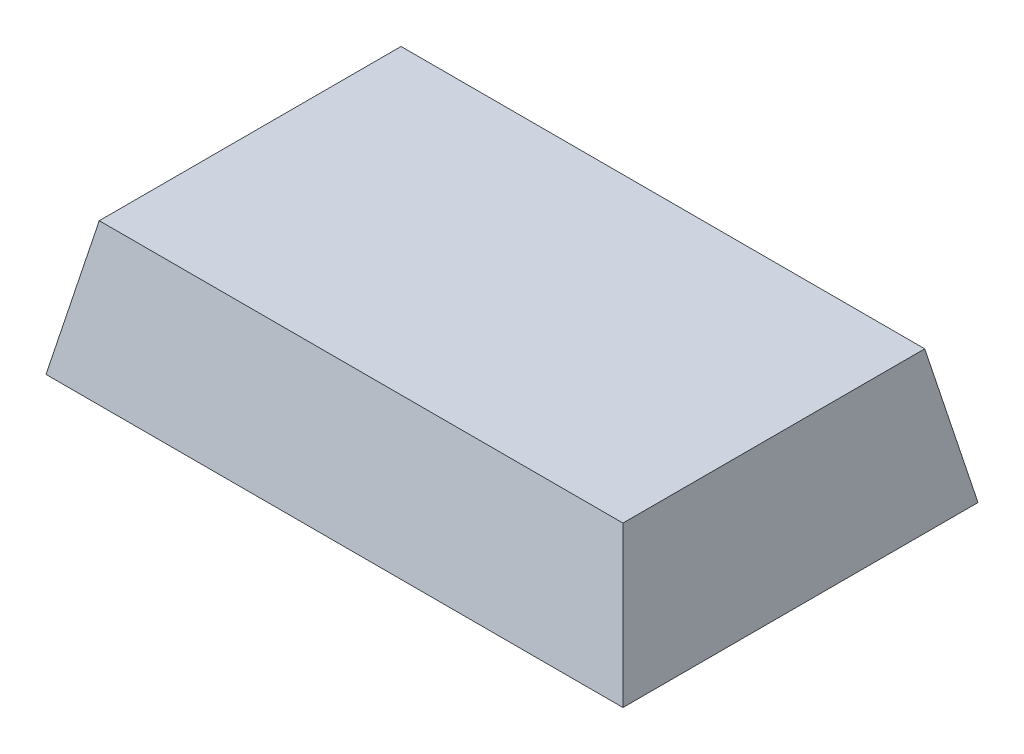
ISO-10303-21;
HEADER;
FILE_DESCRIPTION(('STEP AP214'),'2;1');
FILE_NAME('part.step','',(''),(''),'','','');
FILE_SCHEMA(('AUTOMOTIVE_DESIGN { 1 0 10303 214 1 1 1 1 }'));
ENDSEC;
DATA;
#1=APPLICATION_CONTEXT('core data for automotive mechanical design processes');
#2=APPLICATION_PROTOCOL_DEFINITION('international standard','automotive_design',2000,#1);
#3=PRODUCT_CONTEXT('',#1,'mechanical');
#4=PRODUCT('Part','Part','',(#3));
#5=PRODUCT_RELATED_PRODUCT_CATEGORY('part','',(#4));
#6=PRODUCT_DEFINITION_FORMATION('','',#4);
#7=PRODUCT_DEFINITION_CONTEXT('part definition',#1,'design');
#8=PRODUCT_DEFINITION('design','',#6,#7);
#9=PRODUCT_DEFINITION_SHAPE('','',#8);
#10=(LENGTH_UNIT() NAMED_UNIT(*) SI_UNIT(.MILLI.,.METRE.));
#11=(NAMED_UNIT(*) PLANE_ANGLE_UNIT() SI_UNIT($,.RADIAN.));
#12=(NAMED_UNIT(*) SI_UNIT($,.STERADIAN.) SOLID_ANGLE_UNIT());
#13=UNCERTAINTY_MEASURE_WITH_UNIT(LENGTH_MEASURE(1.E-05),#10,'distance_accuracy_value','');
#14=(GEOMETRIC_REPRESENTATION_CONTEXT(3) GLOBAL_UNCERTAINTY_ASSIGNED_CONTEXT((#13)) GLOBAL_UNIT_ASSIGNED_CONTEXT((#10,
#11,#12)) REPRESENTATION_CONTEXT('',''));
#15=CARTESIAN_POINT('',(0.,0.,0.));
#16=DIRECTION('',(0.,0.,1.));
#17=DIRECTION('',(1.,0.,0.));
#18=AXIS2_PLACEMENT_3D('',#15,#16,#17);
#19=CARTESIAN_POINT('',(0.,3.,0.));
#20=DIRECTION('',(0.,-1.,0.));
#21=DIRECTION('',(0.,0.,-1.));
#22=AXIS2_PLACEMENT_3D('',#19,#20,#21);
#23=PLANE('',#22);
#24=DIRECTION('',(-1.,0.,0.));
#25=VECTOR('',#24,1.);
#26=CARTESIAN_POINT('',(13.000055,3.,-0.6));
#27=LINE('',#26,#25);
#28=CARTESIAN_POINT('',(12.4,3.,-0.6));
#29=VERTEX_POINT('',#28);
#30=CARTESIAN_POINT('',(0.6,3.,-0.6));
#31=VERTEX_POINT('',#30);
#32=EDGE_CURVE('E144',#29,#31,#27,.T.);
#33=ORIENTED_EDGE('',*,*,#32,.F.);
#34=DIRECTION('',(0.,0.,1.));
#35=VECTOR('',#34,1.);
#36=CARTESIAN_POINT('',(12.4,3.,-8.));
#37=LINE('',#36,#35);
#38=CARTESIAN_POINT('',(12.4,3.,-7.4));
#39=VERTEX_POINT('',#38);
#40=EDGE_CURVE('E154',#39,#29,#37,.T.);
#41=ORIENTED_EDGE('',*,*,#40,.F.);
#42=DIRECTION('',(-1.,0.,0.));
#43=VECTOR('',#42,1.);
#44=CARTESIAN_POINT('',(13.000055,3.,-7.4));
#45=LINE('',#44,#43);
#46=CARTESIAN_POINT('',(0.599999999999997,3.,-7.4));
#47=VERTEX_POINT('',#46);
#48=EDGE_CURVE('E139',#39,#47,#45,.T.);
#49=ORIENTED_EDGE('',*,*,#48,.T.);
#50=DIRECTION('',(0.,0.,1.));
#51=VECTOR('',#50,1.);
#52=CARTESIAN_POINT('',(0.6,3.,-8.));
#53=LINE('',#52,#51);
#54=EDGE_CURVE('E160',#47,#31,#53,.T.);
#55=ORIENTED_EDGE('',*,*,#54,.T.);
#56=EDGE_LOOP('',(#33,#41,#49,#55));
#57=FACE_BOUND('',#56,.T.);
#58=ADVANCED_FACE('F42',(#57),#23,.F.);
#59=CARTESIAN_POINT('',(13.,0.,-8.));
#60=DIRECTION('',(-0.98058067569092,-0.196116135138184,0.));
#61=DIRECTION('',(0.196116135138184,-0.98058067569092,0.));
#62=AXIS2_PLACEMENT_3D('',#59,#60,#61);
#63=PLANE('',#62);
#64=DIRECTION('',(-0.192450089729875,0.962250448649376,-0.192450089729875));
#65=VECTOR('',#64,1.);
#66=CARTESIAN_POINT('',(12.7037037037037,1.48148148148148,-0.296296296296295));
#67=LINE('',#66,#65);
#68=CARTESIAN_POINT('',(13.0000245,0.,0.));
#69=VERTEX_POINT('',#68);
#70=EDGE_CURVE('E151',#69,#29,#67,.T.);
#71=ORIENTED_EDGE('',*,*,#70,.F.);
#72=DIRECTION('',(0.,0.,-1.));
#73=VECTOR('',#72,1.);
#74=CARTESIAN_POINT('',(13.,0.,0.));
#75=LINE('',#74,#73);
#76=CARTESIAN_POINT('',(13.0000025,0.,-8.));
#77=VERTEX_POINT('',#76);
#78=EDGE_CURVE('E179',#69,#77,#75,.T.);
#79=ORIENTED_EDGE('',*,*,#78,.T.);
#80=DIRECTION('',(0.192450089729875,-0.962250448649376,-0.192450089729875));
#81=VECTOR('',#80,1.);
#82=CARTESIAN_POINT('',(13.,0.,-8.));
#83=LINE('',#82,#81);
#84=EDGE_CURVE('E147',#39,#77,#83,.T.);
#85=ORIENTED_EDGE('',*,*,#84,.F.);
#86=ORIENTED_EDGE('',*,*,#40,.T.);
#87=EDGE_LOOP('',(#71,#79,#85,#86));
#88=FACE_BOUND('',#87,.T.);
#89=ADVANCED_FACE('F219',(#88),#63,.F.);
#90=CARTESIAN_POINT('',(0.,0.,-8.));
#91=DIRECTION('',(0.98058067569092,-0.196116135138184,0.));
#92=DIRECTION('',(0.196116135138184,0.98058067569092,0.));
#93=AXIS2_PLACEMENT_3D('',#90,#91,#92);
#94=PLANE('',#93);
#95=DIRECTION('',(-0.192450089729875,-0.962250448649376,0.192450089729875));
#96=VECTOR('',#95,1.);
#97=CARTESIAN_POINT('',(0.296296296296296,1.48148148148148,-0.296296296296295));
#98=LINE('',#97,#96);
#99=CARTESIAN_POINT('',(-2.5E-06,0.,0.));
#100=VERTEX_POINT('',#99);
#101=EDGE_CURVE('E185',#31,#100,#98,.T.);
#102=ORIENTED_EDGE('',*,*,#101,.F.);
#103=ORIENTED_EDGE('',*,*,#54,.F.);
#104=DIRECTION('',(0.192450089729875,0.962250448649376,0.192450089729875));
#105=VECTOR('',#104,1.);
#106=CARTESIAN_POINT('',(0.,0.,-8.));
#107=LINE('',#106,#105);
#108=CARTESIAN_POINT('',(0.,0.,-8.));
#109=VERTEX_POINT('',#108);
#110=EDGE_CURVE('E170',#109,#47,#107,.T.);
#111=ORIENTED_EDGE('',*,*,#110,.F.);
#112=DIRECTION('',(0.,0.,1.));
#113=VECTOR('',#112,1.);
#114=CARTESIAN_POINT('',(0.,0.,0.));
#115=LINE('',#114,#113);
#116=EDGE_CURVE('E200',#109,#100,#115,.T.);
#117=ORIENTED_EDGE('',*,*,#116,.T.);
#118=EDGE_LOOP('',(#102,#103,#111,#117));
#119=FACE_BOUND('',#118,.T.);
#120=ADVANCED_FACE('F225',(#119),#94,.F.);
#121=CARTESIAN_POINT('',(0.,0.,0.));
#122=DIRECTION('',(0.,-1.,0.));
#123=DIRECTION('',(0.,0.,-1.));
#124=AXIS2_PLACEMENT_3D('',#121,#122,#123);
#125=PLANE('',#124);
#126=DIRECTION('',(0.,0.,-1.));
#127=VECTOR('',#126,1.);
#128=CARTESIAN_POINT('',(2.500011,0.,-8.));
#129=LINE('',#128,#127);
#130=CARTESIAN_POINT('',(2.500011,0.,-7.));
#131=VERTEX_POINT('',#130);
#132=CARTESIAN_POINT('',(2.500011,0.,-8.));
#133=VERTEX_POINT('',#132);
#134=EDGE_CURVE('E121',#131,#133,#129,.T.);
#135=ORIENTED_EDGE('',*,*,#134,.F.);
#136=DIRECTION('',(-1.,0.,0.));
#137=VECTOR('',#136,1.);
#138=CARTESIAN_POINT('',(2.500011,0.,-7.));
#139=LINE('',#138,#137);
#140=CARTESIAN_POINT('',(10.500011,0.,-7.));
#141=VERTEX_POINT('',#140);
#142=EDGE_CURVE('E109',#141,#131,#139,.T.);
#143=ORIENTED_EDGE('',*,*,#142,.F.);
#144=DIRECTION('',(0.,0.,1.));
#145=VECTOR('',#144,1.);
#146=CARTESIAN_POINT('',(10.500011,0.,-8.));
#147=LINE('',#146,#145);
#148=CARTESIAN_POINT('',(10.500011,0.,-8.));
#149=VERTEX_POINT('',#148);
#150=EDGE_CURVE('E117',#149,#141,#147,.T.);
#151=ORIENTED_EDGE('',*,*,#150,.F.);
#152=DIRECTION('',(-1.,0.,0.));
#153=VECTOR('',#152,1.);
#154=CARTESIAN_POINT('',(0.,0.,-8.));
#155=LINE('',#154,#153);
#156=EDGE_CURVE('E167',#77,#149,#155,.T.);
#157=ORIENTED_EDGE('',*,*,#156,.F.);
#158=ORIENTED_EDGE('',*,*,#78,.F.);
#159=DIRECTION('',(1.,0.,0.));
#160=VECTOR('',#159,1.);
#161=CARTESIAN_POINT('',(0.,0.,0.));
#162=LINE('',#161,#160);
#163=EDGE_CURVE('E356',#100,#69,#162,.T.);
#164=ORIENTED_EDGE('',*,*,#163,.F.);
#165=ORIENTED_EDGE('',*,*,#116,.F.);
#166=EDGE_CURVE('E171',#133,#109,#155,.T.);
#167=ORIENTED_EDGE('',*,*,#166,.F.);
#168=EDGE_LOOP('',(#135,#143,#151,#157,#158,#164,#165,#167));
#169=FACE_BOUND('',#168,.T.);
#170=CARTESIAN_POINT('',(6.50000125,0.,-3.75));
#171=DIRECTION('',(0.,-1.,0.));
#172=DIRECTION('',(0.,0.,-1.));
#173=AXIS2_PLACEMENT_3D('',#170,#171,#172);
#174=CIRCLE('',#173,1.8);
#175=CARTESIAN_POINT('',(6.50000125,0.,-5.55));
#176=VERTEX_POINT('',#175);
#177=EDGE_CURVE('E140',#176,#176,#174,.T.);
#178=ORIENTED_EDGE('',*,*,#177,.F.);
#179=EDGE_LOOP('',(#178));
#180=FACE_BOUND('',#179,.T.);
#181=ADVANCED_FACE('F114',(#169,#180),#125,.T.);
#182=CARTESIAN_POINT('',(13.000055,3.,-7.4));
#183=DIRECTION('',(0.,0.196116135138184,-0.98058067569092));
#184=DIRECTION('',(0.,0.98058067569092,0.196116135138184));
#185=AXIS2_PLACEMENT_3D('',#182,#183,#184);
#186=PLANE('',#185);
#187=ORIENTED_EDGE('',*,*,#84,.T.);
#188=ORIENTED_EDGE('',*,*,#156,.T.);
#189=DIRECTION('',(1.,0.,0.));
#190=VECTOR('',#189,1.);
#191=CARTESIAN_POINT('',(2.500011,0.,-8.));
#192=LINE('',#191,#190);
#193=EDGE_CURVE('E128',#133,#149,#192,.T.);
#194=ORIENTED_EDGE('',*,*,#193,.F.);
#195=ORIENTED_EDGE('',*,*,#166,.T.);
#196=ORIENTED_EDGE('',*,*,#110,.T.);
#197=ORIENTED_EDGE('',*,*,#48,.F.);
#198=EDGE_LOOP('',(#187,#188,#194,#195,#196,#197));
#199=FACE_BOUND('',#198,.T.);
#200=ADVANCED_FACE('F203',(#199),#186,.T.);
#201=CARTESIAN_POINT('',(13.000055,0.,0.));
#202=DIRECTION('',(0.,0.196116135138184,0.98058067569092));
#203=DIRECTION('',(0.,-0.98058067569092,0.196116135138184));
#204=AXIS2_PLACEMENT_3D('',#201,#202,#203);
#205=PLANE('',#204);
#206=ORIENTED_EDGE('',*,*,#70,.T.);
#207=ORIENTED_EDGE('',*,*,#32,.T.);
#208=ORIENTED_EDGE('',*,*,#101,.T.);
#209=ORIENTED_EDGE('',*,*,#163,.T.);
#210=EDGE_LOOP('',(#206,#207,#208,#209));
#211=FACE_BOUND('',#210,.T.);
#212=ADVANCED_FACE('F236',(#211),#205,.T.);
#213=CARTESIAN_POINT('',(6.50000125,0.8,-3.75));
#214=DIRECTION('',(0.,-1.,0.));
#215=DIRECTION('',(0.,0.,-1.));
#216=AXIS2_PLACEMENT_3D('',#213,#214,#215);
#217=CYLINDRICAL_SURFACE('',#216,1.8);
#218=CARTESIAN_POINT('',(6.50000125,0.8,-3.75));
#219=DIRECTION('',(0.,-1.,0.));
#220=DIRECTION('',(0.,0.,-1.));
#221=AXIS2_PLACEMENT_3D('',#218,#219,#220);
#222=CIRCLE('',#221,1.8);
#223=CARTESIAN_POINT('',(6.50000125,0.8,-5.55));
#224=VERTEX_POINT('',#223);
#225=EDGE_CURVE('E135',#224,#224,#222,.T.);
#226=ORIENTED_EDGE('',*,*,#225,.F.);
#227=EDGE_LOOP('',(#226));
#228=FACE_BOUND('',#227,.T.);
#229=ORIENTED_EDGE('',*,*,#177,.T.);
#230=EDGE_LOOP('',(#229));
#231=FACE_BOUND('',#230,.T.);
#232=ADVANCED_FACE('F245',(#228,#231),#217,.F.);
#233=CARTESIAN_POINT('',(6.50000125,0.8,-3.75));
#234=DIRECTION('',(0.,-1.,0.));
#235=DIRECTION('',(0.,0.,-1.));
#236=AXIS2_PLACEMENT_3D('',#233,#234,#235);
#237=PLANE('',#236);
#238=ORIENTED_EDGE('',*,*,#225,.T.);
#239=EDGE_LOOP('',(#238));
#240=FACE_BOUND('',#239,.T.);
#241=ADVANCED_FACE('F249',(#240),#237,.T.);
#242=CARTESIAN_POINT('',(2.500011,-2.,-8.));
#243=DIRECTION('',(0.,0.,1.));
#244=DIRECTION('',(1.,0.,0.));
#245=AXIS2_PLACEMENT_3D('',#242,#243,#244);
#246=PLANE('',#245);
#247=ORIENTED_EDGE('',*,*,#193,.T.);
#248=CARTESIAN_POINT('',(7.03590938486225,2.,-8.));
#249=DIRECTION('',(0.,0.,1.));
#250=DIRECTION('',(1.,0.,0.));
#251=AXIS2_PLACEMENT_3D('',#248,#249,#250);
#252=CIRCLE('',#251,4.);
#253=CARTESIAN_POINT('',(7.03590938486225,-2.,-8.));
#254=VERTEX_POINT('',#253);
#255=EDGE_CURVE('E11',#149,#254,#252,.F.);
#256=ORIENTED_EDGE('',*,*,#255,.T.);
#257=DIRECTION('',(1.,0.,0.));
#258=VECTOR('',#257,1.);
#259=CARTESIAN_POINT('',(2.500011,-2.,-8.));
#260=LINE('',#259,#258);
#261=CARTESIAN_POINT('',(5.96411261513776,-2.,-8.));
#262=VERTEX_POINT('',#261);
#263=EDGE_CURVE('E123',#262,#254,#260,.T.);
#264=ORIENTED_EDGE('',*,*,#263,.F.);
#265=CARTESIAN_POINT('',(5.96411261513776,2.,-8.));
#266=DIRECTION('',(0.,0.,1.));
#267=DIRECTION('',(1.,0.,0.));
#268=AXIS2_PLACEMENT_3D('',#265,#266,#267);
#269=CIRCLE('',#268,4.);
#270=EDGE_CURVE('E51',#262,#133,#269,.F.);
#271=ORIENTED_EDGE('',*,*,#270,.T.);
#272=EDGE_LOOP('',(#247,#256,#264,#271));
#273=FACE_BOUND('',#272,.T.);
#274=ADVANCED_FACE('F192',(#273),#246,.F.);
#275=CARTESIAN_POINT('',(2.500011,-2.,-7.));
#276=DIRECTION('',(0.,0.,-1.));
#277=DIRECTION('',(-1.,0.,0.));
#278=AXIS2_PLACEMENT_3D('',#275,#276,#277);
#279=PLANE('',#278);
#280=DIRECTION('',(-1.,0.,0.));
#281=VECTOR('',#280,1.);
#282=CARTESIAN_POINT('',(2.500011,-2.,-7.));
#283=LINE('',#282,#281);
#284=CARTESIAN_POINT('',(7.03590938486224,-2.,-7.));
#285=VERTEX_POINT('',#284);
#286=CARTESIAN_POINT('',(5.96411261513776,-2.,-7.));
#287=VERTEX_POINT('',#286);
#288=EDGE_CURVE('E110',#285,#287,#283,.T.);
#289=ORIENTED_EDGE('',*,*,#288,.F.);
#290=CARTESIAN_POINT('',(7.03590938486224,2.,-7.));
#291=DIRECTION('',(0.,0.,-1.));
#292=DIRECTION('',(-1.,0.,0.));
#293=AXIS2_PLACEMENT_3D('',#290,#291,#292);
#294=CIRCLE('',#293,4.);
#295=EDGE_CURVE('E66',#285,#141,#294,.F.);
#296=ORIENTED_EDGE('',*,*,#295,.T.);
#297=ORIENTED_EDGE('',*,*,#142,.T.);
#298=CARTESIAN_POINT('',(5.96411261513776,2.,-7.));
#299=DIRECTION('',(0.,0.,-1.));
#300=DIRECTION('',(-1.,0.,0.));
#301=AXIS2_PLACEMENT_3D('',#298,#299,#300);
#302=CIRCLE('',#301,4.);
#303=EDGE_CURVE('E58',#131,#287,#302,.F.);
#304=ORIENTED_EDGE('',*,*,#303,.T.);
#305=EDGE_LOOP('',(#289,#296,#297,#304));
#306=FACE_BOUND('',#305,.T.);
#307=ADVANCED_FACE('F108',(#306),#279,.F.);
#308=CARTESIAN_POINT('',(0.,-2.,0.));
#309=DIRECTION('',(0.,1.,0.));
#310=DIRECTION('',(0.,0.,1.));
#311=AXIS2_PLACEMENT_3D('',#308,#309,#310);
#312=PLANE('',#311);
#313=ORIENTED_EDGE('',*,*,#263,.T.);
#314=DIRECTION('',(0.,0.,1.));
#315=VECTOR('',#314,1.);
#316=CARTESIAN_POINT('',(7.03590938486223,-2.,0.));
#317=LINE('',#316,#315);
#318=EDGE_CURVE('E184',#254,#285,#317,.T.);
#319=ORIENTED_EDGE('',*,*,#318,.T.);
#320=ORIENTED_EDGE('',*,*,#288,.T.);
#321=DIRECTION('',(0.,0.,-1.));
#322=VECTOR('',#321,1.);
#323=CARTESIAN_POINT('',(5.96411261513776,-2.,0.));
#324=LINE('',#323,#322);
#325=EDGE_CURVE('E180',#287,#262,#324,.T.);
#326=ORIENTED_EDGE('',*,*,#325,.T.);
#327=EDGE_LOOP('',(#313,#319,#320,#326));
#328=FACE_BOUND('',#327,.T.);
#329=ADVANCED_FACE('F210',(#328),#312,.F.);
#330=CARTESIAN_POINT('',(7.03590938486225,2.,-8.00000000000001));
#331=DIRECTION('',(0.,0.,1.));
#332=DIRECTION('',(1.,0.,0.));
#333=AXIS2_PLACEMENT_3D('',#330,#331,#332);
#334=CYLINDRICAL_SURFACE('',#333,4.);
#335=ORIENTED_EDGE('',*,*,#255,.F.);
#336=ORIENTED_EDGE('',*,*,#150,.T.);
#337=ORIENTED_EDGE('',*,*,#295,.F.);
#338=ORIENTED_EDGE('',*,*,#318,.F.);
#339=EDGE_LOOP('',(#335,#336,#337,#338));
#340=FACE_BOUND('',#339,.T.);
#341=ADVANCED_FACE('F126',(#340),#334,.T.);
#342=CARTESIAN_POINT('',(5.96411261513776,2.,-8.));
#343=DIRECTION('',(0.,0.,-1.));
#344=DIRECTION('',(-1.,0.,0.));
#345=AXIS2_PLACEMENT_3D('',#342,#343,#344);
#346=CYLINDRICAL_SURFACE('',#345,4.);
#347=ORIENTED_EDGE('',*,*,#303,.F.);
#348=ORIENTED_EDGE('',*,*,#134,.T.);
#349=ORIENTED_EDGE('',*,*,#270,.F.);
#350=ORIENTED_EDGE('',*,*,#325,.F.);
#351=EDGE_LOOP('',(#347,#348,#349,#350));
#352=FACE_BOUND('',#351,.T.);
#353=ADVANCED_FACE('F44',(#352),#346,.T.);
#354=CLOSED_SHELL('',(#58,#89,#120,#181,#200,#212,#232,#241,#274,#307,#329,#341,#353));
#355=MANIFOLD_SOLID_BREP('B2',#354);
#356=ADVANCED_BREP_SHAPE_REPRESENTATION('',(#18,#355),#14);
#357=SHAPE_DEFINITION_REPRESENTATION(#9,#356);
ENDSEC;
END-ISO-10303-21;
